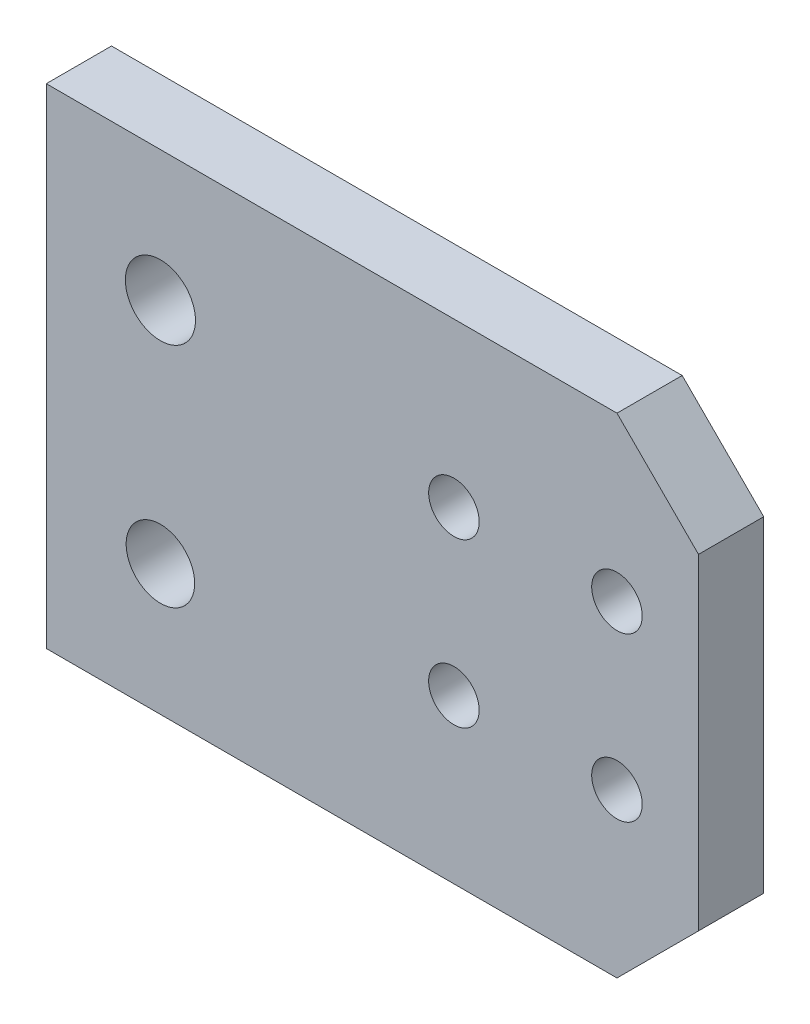
ISO-10303-21;
HEADER;
FILE_DESCRIPTION(('STEP AP214'),'2;1');
FILE_NAME('part.step','',(''),(''),'','','');
FILE_SCHEMA(('AUTOMOTIVE_DESIGN { 1 0 10303 214 1 1 1 1 }'));
ENDSEC;
DATA;
#1=APPLICATION_CONTEXT('core data for automotive mechanical design processes');
#2=APPLICATION_PROTOCOL_DEFINITION('international standard','automotive_design',2000,#1);
#3=PRODUCT_CONTEXT('',#1,'mechanical');
#4=PRODUCT('Part','Part','',(#3));
#5=PRODUCT_RELATED_PRODUCT_CATEGORY('part','',(#4));
#6=PRODUCT_DEFINITION_FORMATION('','',#4);
#7=PRODUCT_DEFINITION_CONTEXT('part definition',#1,'design');
#8=PRODUCT_DEFINITION('design','',#6,#7);
#9=PRODUCT_DEFINITION_SHAPE('','',#8);
#10=(LENGTH_UNIT() NAMED_UNIT(*) SI_UNIT(.MILLI.,.METRE.));
#11=(NAMED_UNIT(*) PLANE_ANGLE_UNIT() SI_UNIT($,.RADIAN.));
#12=(NAMED_UNIT(*) SI_UNIT($,.STERADIAN.) SOLID_ANGLE_UNIT());
#13=UNCERTAINTY_MEASURE_WITH_UNIT(LENGTH_MEASURE(1.E-05),#10,'distance_accuracy_value','');
#14=(GEOMETRIC_REPRESENTATION_CONTEXT(3) GLOBAL_UNCERTAINTY_ASSIGNED_CONTEXT((#13)) GLOBAL_UNIT_ASSIGNED_CONTEXT((#10,
#11,#12)) REPRESENTATION_CONTEXT('',''));
#15=CARTESIAN_POINT('',(0.,0.,0.));
#16=DIRECTION('',(0.,0.,1.));
#17=DIRECTION('',(1.,0.,0.));
#18=AXIS2_PLACEMENT_3D('',#15,#16,#17);
#19=CARTESIAN_POINT('',(0.,0.,-4.));
#20=DIRECTION('',(0.,0.,1.));
#21=DIRECTION('',(-1.,0.,0.));
#22=AXIS2_PLACEMENT_3D('',#19,#20,#21);
#23=PLANE('',#22);
#24=DIRECTION('',(1.,0.,0.));
#25=VECTOR('',#24,1.);
#26=CARTESIAN_POINT('',(0.,0.,-4.));
#27=LINE('',#26,#25);
#28=CARTESIAN_POINT('',(0.,0.,-4.));
#29=VERTEX_POINT('',#28);
#30=CARTESIAN_POINT('',(35.,0.,-4.));
#31=VERTEX_POINT('',#30);
#32=EDGE_CURVE('E99',#29,#31,#27,.T.);
#33=ORIENTED_EDGE('',*,*,#32,.F.);
#34=DIRECTION('',(0.,-1.,0.));
#35=VECTOR('',#34,1.);
#36=CARTESIAN_POINT('',(0.,0.,-4.));
#37=LINE('',#36,#35);
#38=CARTESIAN_POINT('',(0.,30.,-4.));
#39=VERTEX_POINT('',#38);
#40=EDGE_CURVE('E109',#39,#29,#37,.T.);
#41=ORIENTED_EDGE('',*,*,#40,.F.);
#42=DIRECTION('',(-1.,0.,0.));
#43=VECTOR('',#42,1.);
#44=CARTESIAN_POINT('',(0.,30.,-4.));
#45=LINE('',#44,#43);
#46=CARTESIAN_POINT('',(35.,30.,-4.));
#47=VERTEX_POINT('',#46);
#48=EDGE_CURVE('E120',#47,#39,#45,.T.);
#49=ORIENTED_EDGE('',*,*,#48,.F.);
#50=DIRECTION('',(0.707106781186546,-0.70710678118655,0.));
#51=VECTOR('',#50,1.);
#52=CARTESIAN_POINT('',(35.,30.,-4.));
#53=LINE('',#52,#51);
#54=CARTESIAN_POINT('',(40.,25.,-4.));
#55=VERTEX_POINT('',#54);
#56=EDGE_CURVE('E144',#55,#47,#53,.F.);
#57=ORIENTED_EDGE('',*,*,#56,.F.);
#58=DIRECTION('',(0.,1.,0.));
#59=VECTOR('',#58,1.);
#60=CARTESIAN_POINT('',(40.,0.,-4.));
#61=LINE('',#60,#59);
#62=CARTESIAN_POINT('',(40.,5.,-4.));
#63=VERTEX_POINT('',#62);
#64=EDGE_CURVE('E117',#63,#55,#61,.T.);
#65=ORIENTED_EDGE('',*,*,#64,.F.);
#66=DIRECTION('',(-0.707106781186549,-0.707106781186547,0.));
#67=VECTOR('',#66,1.);
#68=CARTESIAN_POINT('',(40.,5.,-4.));
#69=LINE('',#68,#67);
#70=EDGE_CURVE('E50',#31,#63,#69,.F.);
#71=ORIENTED_EDGE('',*,*,#70,.F.);
#72=EDGE_LOOP('',(#33,#41,#49,#57,#65,#71));
#73=FACE_BOUND('',#72,.T.);
#74=CARTESIAN_POINT('',(7.,22.,-4.));
#75=DIRECTION('',(0.,0.,1.));
#76=DIRECTION('',(1.,0.,0.));
#77=AXIS2_PLACEMENT_3D('',#74,#75,#76);
#78=CIRCLE('',#77,2.14999999999999);
#79=CARTESIAN_POINT('',(9.14999999999999,22.,-4.));
#80=VERTEX_POINT('',#79);
#81=EDGE_CURVE('E127',#80,#80,#78,.T.);
#82=ORIENTED_EDGE('',*,*,#81,.T.);
#83=EDGE_LOOP('',(#82));
#84=FACE_BOUND('',#83,.T.);
#85=CARTESIAN_POINT('',(7.,8.00000000000005,-4.));
#86=DIRECTION('',(0.,0.,1.));
#87=DIRECTION('',(1.,0.,0.));
#88=AXIS2_PLACEMENT_3D('',#85,#86,#87);
#89=CIRCLE('',#88,2.09999999999999);
#90=CARTESIAN_POINT('',(9.09999999999999,8.00000000000005,-4.));
#91=VERTEX_POINT('',#90);
#92=EDGE_CURVE('E226',#91,#91,#89,.T.);
#93=ORIENTED_EDGE('',*,*,#92,.T.);
#94=EDGE_LOOP('',(#93));
#95=FACE_BOUND('',#94,.T.);
#96=CARTESIAN_POINT('',(35.,20.,-4.));
#97=DIRECTION('',(0.,0.,1.));
#98=DIRECTION('',(1.,0.,0.));
#99=AXIS2_PLACEMENT_3D('',#96,#97,#98);
#100=CIRCLE('',#99,1.54999999999999);
#101=CARTESIAN_POINT('',(36.55,20.,-4.));
#102=VERTEX_POINT('',#101);
#103=EDGE_CURVE('E220',#102,#102,#100,.T.);
#104=ORIENTED_EDGE('',*,*,#103,.T.);
#105=EDGE_LOOP('',(#104));
#106=FACE_BOUND('',#105,.T.);
#107=CARTESIAN_POINT('',(25.,19.9999999999999,-4.));
#108=DIRECTION('',(0.,0.,1.));
#109=DIRECTION('',(1.,0.,0.));
#110=AXIS2_PLACEMENT_3D('',#107,#108,#109);
#111=CIRCLE('',#110,1.54999999999999);
#112=CARTESIAN_POINT('',(26.55,19.9999999999999,-4.));
#113=VERTEX_POINT('',#112);
#114=EDGE_CURVE('E214',#113,#113,#111,.T.);
#115=ORIENTED_EDGE('',*,*,#114,.T.);
#116=EDGE_LOOP('',(#115));
#117=FACE_BOUND('',#116,.T.);
#118=CARTESIAN_POINT('',(25.0000000000001,9.99999999999993,-4.));
#119=DIRECTION('',(0.,0.,1.));
#120=DIRECTION('',(1.,0.,0.));
#121=AXIS2_PLACEMENT_3D('',#118,#119,#120);
#122=CIRCLE('',#121,1.54999999999999);
#123=CARTESIAN_POINT('',(26.5500000000001,9.99999999999993,-4.));
#124=VERTEX_POINT('',#123);
#125=EDGE_CURVE('E208',#124,#124,#122,.T.);
#126=ORIENTED_EDGE('',*,*,#125,.T.);
#127=EDGE_LOOP('',(#126));
#128=FACE_BOUND('',#127,.T.);
#129=CARTESIAN_POINT('',(35.0000000000001,10.,-4.));
#130=DIRECTION('',(0.,0.,1.));
#131=DIRECTION('',(1.,0.,0.));
#132=AXIS2_PLACEMENT_3D('',#129,#130,#131);
#133=CIRCLE('',#132,1.54999999999999);
#134=CARTESIAN_POINT('',(36.5500000000001,10.,-4.));
#135=VERTEX_POINT('',#134);
#136=EDGE_CURVE('E199',#135,#135,#133,.T.);
#137=ORIENTED_EDGE('',*,*,#136,.T.);
#138=EDGE_LOOP('',(#137));
#139=FACE_BOUND('',#138,.T.);
#140=ADVANCED_FACE('F42',(#73,#84,#95,#106,#117,#128,#139),#23,.F.);
#141=CARTESIAN_POINT('',(0.,0.,0.));
#142=DIRECTION('',(0.,0.,1.));
#143=DIRECTION('',(-1.,0.,0.));
#144=AXIS2_PLACEMENT_3D('',#141,#142,#143);
#145=PLANE('',#144);
#146=CARTESIAN_POINT('',(25.0000000000001,9.99999999999993,0.));
#147=DIRECTION('',(0.,0.,1.));
#148=DIRECTION('',(1.,0.,0.));
#149=AXIS2_PLACEMENT_3D('',#146,#147,#148);
#150=CIRCLE('',#149,1.54999999999999);
#151=CARTESIAN_POINT('',(26.5500000000001,9.99999999999993,0.));
#152=VERTEX_POINT('',#151);
#153=EDGE_CURVE('E205',#152,#152,#150,.T.);
#154=ORIENTED_EDGE('',*,*,#153,.F.);
#155=EDGE_LOOP('',(#154));
#156=FACE_BOUND('',#155,.T.);
#157=CARTESIAN_POINT('',(35.,20.,0.));
#158=DIRECTION('',(0.,0.,1.));
#159=DIRECTION('',(1.,0.,0.));
#160=AXIS2_PLACEMENT_3D('',#157,#158,#159);
#161=CIRCLE('',#160,1.54999999999999);
#162=CARTESIAN_POINT('',(36.55,20.,0.));
#163=VERTEX_POINT('',#162);
#164=EDGE_CURVE('E217',#163,#163,#161,.T.);
#165=ORIENTED_EDGE('',*,*,#164,.F.);
#166=EDGE_LOOP('',(#165));
#167=FACE_BOUND('',#166,.T.);
#168=CARTESIAN_POINT('',(7.,22.,0.));
#169=DIRECTION('',(0.,0.,1.));
#170=DIRECTION('',(1.,0.,0.));
#171=AXIS2_PLACEMENT_3D('',#168,#169,#170);
#172=CIRCLE('',#171,2.14999999999999);
#173=CARTESIAN_POINT('',(9.14999999999999,22.,0.));
#174=VERTEX_POINT('',#173);
#175=EDGE_CURVE('E229',#174,#174,#172,.T.);
#176=ORIENTED_EDGE('',*,*,#175,.F.);
#177=EDGE_LOOP('',(#176));
#178=FACE_BOUND('',#177,.T.);
#179=DIRECTION('',(0.,1.,0.));
#180=VECTOR('',#179,1.);
#181=CARTESIAN_POINT('',(40.,0.,0.));
#182=LINE('',#181,#180);
#183=CARTESIAN_POINT('',(40.,5.,0.));
#184=VERTEX_POINT('',#183);
#185=CARTESIAN_POINT('',(40.,25.,0.));
#186=VERTEX_POINT('',#185);
#187=EDGE_CURVE('E129',#184,#186,#182,.T.);
#188=ORIENTED_EDGE('',*,*,#187,.T.);
#189=DIRECTION('',(-0.707106781186546,0.70710678118655,0.));
#190=VECTOR('',#189,1.);
#191=CARTESIAN_POINT('',(32.5000000000001,32.4999999999999,0.));
#192=LINE('',#191,#190);
#193=CARTESIAN_POINT('',(35.,30.,0.));
#194=VERTEX_POINT('',#193);
#195=EDGE_CURVE('E138',#194,#186,#192,.F.);
#196=ORIENTED_EDGE('',*,*,#195,.F.);
#197=DIRECTION('',(-1.,0.,0.));
#198=VECTOR('',#197,1.);
#199=CARTESIAN_POINT('',(0.,30.,0.));
#200=LINE('',#199,#198);
#201=CARTESIAN_POINT('',(0.,30.,0.));
#202=VERTEX_POINT('',#201);
#203=EDGE_CURVE('E113',#194,#202,#200,.T.);
#204=ORIENTED_EDGE('',*,*,#203,.T.);
#205=DIRECTION('',(0.,-1.,0.));
#206=VECTOR('',#205,1.);
#207=CARTESIAN_POINT('',(0.,0.,0.));
#208=LINE('',#207,#206);
#209=CARTESIAN_POINT('',(0.,0.,0.));
#210=VERTEX_POINT('',#209);
#211=EDGE_CURVE('E125',#202,#210,#208,.T.);
#212=ORIENTED_EDGE('',*,*,#211,.T.);
#213=DIRECTION('',(1.,0.,0.));
#214=VECTOR('',#213,1.);
#215=CARTESIAN_POINT('',(0.,0.,0.));
#216=LINE('',#215,#214);
#217=CARTESIAN_POINT('',(35.,0.,0.));
#218=VERTEX_POINT('',#217);
#219=EDGE_CURVE('E101',#210,#218,#216,.T.);
#220=ORIENTED_EDGE('',*,*,#219,.T.);
#221=DIRECTION('',(0.707106781186549,0.707106781186547,0.));
#222=VECTOR('',#221,1.);
#223=CARTESIAN_POINT('',(17.4999999999999,-17.5,0.));
#224=LINE('',#223,#222);
#225=EDGE_CURVE('E141',#184,#218,#224,.F.);
#226=ORIENTED_EDGE('',*,*,#225,.F.);
#227=EDGE_LOOP('',(#188,#196,#204,#212,#220,#226));
#228=FACE_BOUND('',#227,.T.);
#229=CARTESIAN_POINT('',(7.,8.00000000000005,0.));
#230=DIRECTION('',(0.,0.,1.));
#231=DIRECTION('',(1.,0.,0.));
#232=AXIS2_PLACEMENT_3D('',#229,#230,#231);
#233=CIRCLE('',#232,2.09999999999999);
#234=CARTESIAN_POINT('',(9.09999999999999,8.00000000000005,0.));
#235=VERTEX_POINT('',#234);
#236=EDGE_CURVE('E223',#235,#235,#233,.T.);
#237=ORIENTED_EDGE('',*,*,#236,.F.);
#238=EDGE_LOOP('',(#237));
#239=FACE_BOUND('',#238,.T.);
#240=CARTESIAN_POINT('',(25.,19.9999999999999,0.));
#241=DIRECTION('',(0.,0.,1.));
#242=DIRECTION('',(1.,0.,0.));
#243=AXIS2_PLACEMENT_3D('',#240,#241,#242);
#244=CIRCLE('',#243,1.54999999999999);
#245=CARTESIAN_POINT('',(26.55,19.9999999999999,0.));
#246=VERTEX_POINT('',#245);
#247=EDGE_CURVE('E211',#246,#246,#244,.T.);
#248=ORIENTED_EDGE('',*,*,#247,.F.);
#249=EDGE_LOOP('',(#248));
#250=FACE_BOUND('',#249,.T.);
#251=CARTESIAN_POINT('',(35.0000000000001,10.,0.));
#252=DIRECTION('',(0.,0.,1.));
#253=DIRECTION('',(1.,0.,0.));
#254=AXIS2_PLACEMENT_3D('',#251,#252,#253);
#255=CIRCLE('',#254,1.54999999999999);
#256=CARTESIAN_POINT('',(36.5500000000001,10.,0.));
#257=VERTEX_POINT('',#256);
#258=EDGE_CURVE('E202',#257,#257,#255,.T.);
#259=ORIENTED_EDGE('',*,*,#258,.F.);
#260=EDGE_LOOP('',(#259));
#261=FACE_BOUND('',#260,.T.);
#262=ADVANCED_FACE('F153',(#156,#167,#178,#228,#239,#250,#261),#145,.T.);
#263=CARTESIAN_POINT('',(0.,0.,-4.));
#264=DIRECTION('',(1.,0.,0.));
#265=DIRECTION('',(0.,0.,1.));
#266=AXIS2_PLACEMENT_3D('',#263,#264,#265);
#267=PLANE('',#266);
#268=ORIENTED_EDGE('',*,*,#211,.F.);
#269=DIRECTION('',(0.,0.,1.));
#270=VECTOR('',#269,1.);
#271=CARTESIAN_POINT('',(0.,30.,-4.));
#272=LINE('',#271,#270);
#273=EDGE_CURVE('E106',#39,#202,#272,.T.);
#274=ORIENTED_EDGE('',*,*,#273,.F.);
#275=ORIENTED_EDGE('',*,*,#40,.T.);
#276=DIRECTION('',(0.,0.,1.));
#277=VECTOR('',#276,1.);
#278=CARTESIAN_POINT('',(0.,0.,-4.));
#279=LINE('',#278,#277);
#280=EDGE_CURVE('E95',#29,#210,#279,.T.);
#281=ORIENTED_EDGE('',*,*,#280,.T.);
#282=EDGE_LOOP('',(#268,#274,#275,#281));
#283=FACE_BOUND('',#282,.T.);
#284=ADVANCED_FACE('F110',(#283),#267,.F.);
#285=CARTESIAN_POINT('',(0.,0.,-4.));
#286=DIRECTION('',(0.,1.,0.));
#287=DIRECTION('',(0.,0.,-1.));
#288=AXIS2_PLACEMENT_3D('',#285,#286,#287);
#289=PLANE('',#288);
#290=ORIENTED_EDGE('',*,*,#219,.F.);
#291=ORIENTED_EDGE('',*,*,#280,.F.);
#292=ORIENTED_EDGE('',*,*,#32,.T.);
#293=DIRECTION('',(0.,0.,-1.));
#294=VECTOR('',#293,1.);
#295=CARTESIAN_POINT('',(35.,0.,-4.));
#296=LINE('',#295,#294);
#297=EDGE_CURVE('E63',#218,#31,#296,.T.);
#298=ORIENTED_EDGE('',*,*,#297,.F.);
#299=EDGE_LOOP('',(#290,#291,#292,#298));
#300=FACE_BOUND('',#299,.T.);
#301=ADVANCED_FACE('F97',(#300),#289,.F.);
#302=CARTESIAN_POINT('',(40.,0.,-4.));
#303=DIRECTION('',(-1.,0.,0.));
#304=DIRECTION('',(0.,0.,-1.));
#305=AXIS2_PLACEMENT_3D('',#302,#303,#304);
#306=PLANE('',#305);
#307=ORIENTED_EDGE('',*,*,#64,.T.);
#308=DIRECTION('',(0.,0.,-1.));
#309=VECTOR('',#308,1.);
#310=CARTESIAN_POINT('',(40.,25.,-4.));
#311=LINE('',#310,#309);
#312=EDGE_CURVE('E105',#186,#55,#311,.T.);
#313=ORIENTED_EDGE('',*,*,#312,.F.);
#314=ORIENTED_EDGE('',*,*,#187,.F.);
#315=DIRECTION('',(0.,0.,1.));
#316=VECTOR('',#315,1.);
#317=CARTESIAN_POINT('',(40.,5.,-4.));
#318=LINE('',#317,#316);
#319=EDGE_CURVE('E136',#63,#184,#318,.T.);
#320=ORIENTED_EDGE('',*,*,#319,.F.);
#321=EDGE_LOOP('',(#307,#313,#314,#320));
#322=FACE_BOUND('',#321,.T.);
#323=ADVANCED_FACE('F149',(#322),#306,.F.);
#324=CARTESIAN_POINT('',(0.,30.,-4.));
#325=DIRECTION('',(0.,-1.,0.));
#326=DIRECTION('',(0.,0.,1.));
#327=AXIS2_PLACEMENT_3D('',#324,#325,#326);
#328=PLANE('',#327);
#329=ORIENTED_EDGE('',*,*,#48,.T.);
#330=ORIENTED_EDGE('',*,*,#273,.T.);
#331=ORIENTED_EDGE('',*,*,#203,.F.);
#332=DIRECTION('',(0.,0.,1.));
#333=VECTOR('',#332,1.);
#334=CARTESIAN_POINT('',(35.,30.,-4.));
#335=LINE('',#334,#333);
#336=EDGE_CURVE('E11',#47,#194,#335,.T.);
#337=ORIENTED_EDGE('',*,*,#336,.F.);
#338=EDGE_LOOP('',(#329,#330,#331,#337));
#339=FACE_BOUND('',#338,.T.);
#340=ADVANCED_FACE('F155',(#339),#328,.F.);
#341=CARTESIAN_POINT('',(7.,22.,-4.));
#342=DIRECTION('',(0.,0.,1.));
#343=DIRECTION('',(-1.,0.,0.));
#344=AXIS2_PLACEMENT_3D('',#341,#342,#343);
#345=CYLINDRICAL_SURFACE('',#344,2.14999999999999);
#346=ORIENTED_EDGE('',*,*,#81,.F.);
#347=EDGE_LOOP('',(#346));
#348=FACE_BOUND('',#347,.T.);
#349=ORIENTED_EDGE('',*,*,#175,.T.);
#350=EDGE_LOOP('',(#349));
#351=FACE_BOUND('',#350,.T.);
#352=ADVANCED_FACE('F157',(#348,#351),#345,.F.);
#353=CARTESIAN_POINT('',(7.,8.00000000000005,-4.));
#354=DIRECTION('',(0.,0.,1.));
#355=DIRECTION('',(-1.,0.,0.));
#356=AXIS2_PLACEMENT_3D('',#353,#354,#355);
#357=CYLINDRICAL_SURFACE('',#356,2.09999999999999);
#358=ORIENTED_EDGE('',*,*,#92,.F.);
#359=EDGE_LOOP('',(#358));
#360=FACE_BOUND('',#359,.T.);
#361=ORIENTED_EDGE('',*,*,#236,.T.);
#362=EDGE_LOOP('',(#361));
#363=FACE_BOUND('',#362,.T.);
#364=ADVANCED_FACE('F163',(#360,#363),#357,.F.);
#365=CARTESIAN_POINT('',(35.,20.,-4.));
#366=DIRECTION('',(0.,0.,1.));
#367=DIRECTION('',(-1.,0.,0.));
#368=AXIS2_PLACEMENT_3D('',#365,#366,#367);
#369=CYLINDRICAL_SURFACE('',#368,1.54999999999999);
#370=ORIENTED_EDGE('',*,*,#103,.F.);
#371=EDGE_LOOP('',(#370));
#372=FACE_BOUND('',#371,.T.);
#373=ORIENTED_EDGE('',*,*,#164,.T.);
#374=EDGE_LOOP('',(#373));
#375=FACE_BOUND('',#374,.T.);
#376=ADVANCED_FACE('F177',(#372,#375),#369,.F.);
#377=CARTESIAN_POINT('',(25.,19.9999999999999,-4.));
#378=DIRECTION('',(0.,0.,1.));
#379=DIRECTION('',(-1.,0.,0.));
#380=AXIS2_PLACEMENT_3D('',#377,#378,#379);
#381=CYLINDRICAL_SURFACE('',#380,1.54999999999999);
#382=ORIENTED_EDGE('',*,*,#114,.F.);
#383=EDGE_LOOP('',(#382));
#384=FACE_BOUND('',#383,.T.);
#385=ORIENTED_EDGE('',*,*,#247,.T.);
#386=EDGE_LOOP('',(#385));
#387=FACE_BOUND('',#386,.T.);
#388=ADVANCED_FACE('F181',(#384,#387),#381,.F.);
#389=CARTESIAN_POINT('',(25.0000000000001,9.99999999999993,-4.));
#390=DIRECTION('',(0.,0.,1.));
#391=DIRECTION('',(-1.,0.,0.));
#392=AXIS2_PLACEMENT_3D('',#389,#390,#391);
#393=CYLINDRICAL_SURFACE('',#392,1.54999999999999);
#394=ORIENTED_EDGE('',*,*,#125,.F.);
#395=EDGE_LOOP('',(#394));
#396=FACE_BOUND('',#395,.T.);
#397=ORIENTED_EDGE('',*,*,#153,.T.);
#398=EDGE_LOOP('',(#397));
#399=FACE_BOUND('',#398,.T.);
#400=ADVANCED_FACE('F185',(#396,#399),#393,.F.);
#401=CARTESIAN_POINT('',(35.0000000000001,10.,-4.));
#402=DIRECTION('',(0.,0.,1.));
#403=DIRECTION('',(-1.,0.,0.));
#404=AXIS2_PLACEMENT_3D('',#401,#402,#403);
#405=CYLINDRICAL_SURFACE('',#404,1.54999999999999);
#406=ORIENTED_EDGE('',*,*,#136,.F.);
#407=EDGE_LOOP('',(#406));
#408=FACE_BOUND('',#407,.T.);
#409=ORIENTED_EDGE('',*,*,#258,.T.);
#410=EDGE_LOOP('',(#409));
#411=FACE_BOUND('',#410,.T.);
#412=ADVANCED_FACE('F189',(#408,#411),#405,.F.);
#413=CARTESIAN_POINT('',(40.,5.,-4.));
#414=DIRECTION('',(-0.707106781186547,0.707106781186549,0.));
#415=DIRECTION('',(0.,0.,1.));
#416=AXIS2_PLACEMENT_3D('',#413,#414,#415);
#417=PLANE('',#416);
#418=ORIENTED_EDGE('',*,*,#70,.T.);
#419=ORIENTED_EDGE('',*,*,#319,.T.);
#420=ORIENTED_EDGE('',*,*,#225,.T.);
#421=ORIENTED_EDGE('',*,*,#297,.T.);
#422=EDGE_LOOP('',(#418,#419,#420,#421));
#423=FACE_BOUND('',#422,.T.);
#424=ADVANCED_FACE('F145',(#423),#417,.F.);
#425=CARTESIAN_POINT('',(35.,30.,-4.));
#426=DIRECTION('',(-0.70710678118655,-0.707106781186546,0.));
#427=DIRECTION('',(0.,0.,1.));
#428=AXIS2_PLACEMENT_3D('',#425,#426,#427);
#429=PLANE('',#428);
#430=ORIENTED_EDGE('',*,*,#56,.T.);
#431=ORIENTED_EDGE('',*,*,#336,.T.);
#432=ORIENTED_EDGE('',*,*,#195,.T.);
#433=ORIENTED_EDGE('',*,*,#312,.T.);
#434=EDGE_LOOP('',(#430,#431,#432,#433));
#435=FACE_BOUND('',#434,.T.);
#436=ADVANCED_FACE('F44',(#435),#429,.F.);
#437=CLOSED_SHELL('',(#140,#262,#284,#301,#323,#340,#352,#364,#376,#388,#400,#412,#424,#436));
#438=MANIFOLD_SOLID_BREP('B2',#437);
#439=ADVANCED_BREP_SHAPE_REPRESENTATION('',(#18,#438),#14);
#440=SHAPE_DEFINITION_REPRESENTATION(#9,#439);
ENDSEC;
END-ISO-10303-21;
